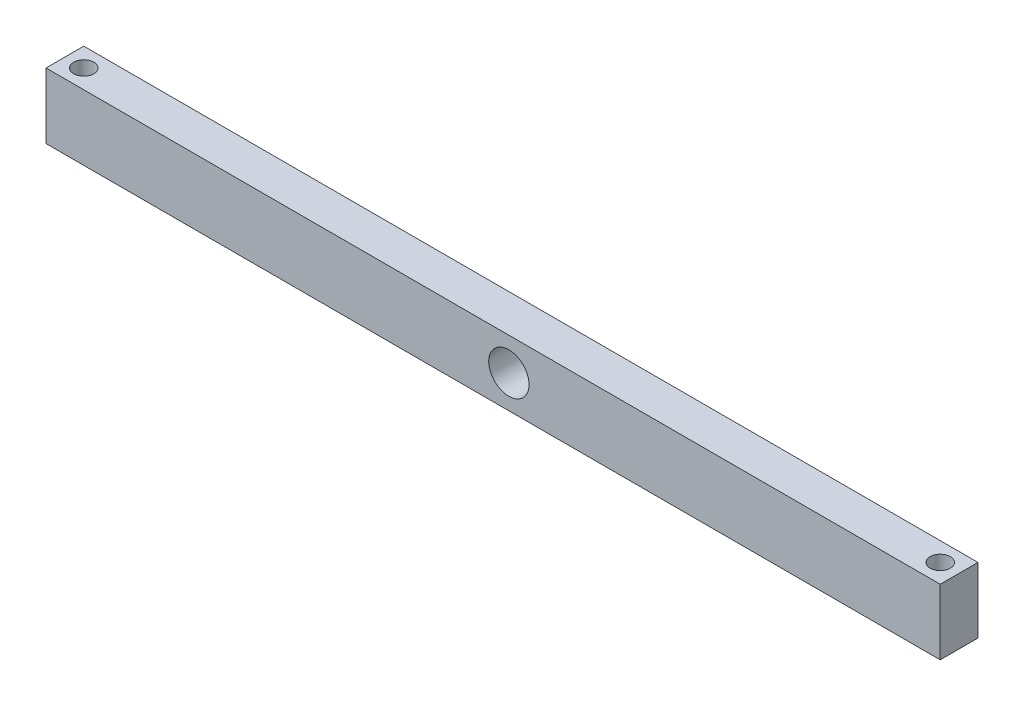
ISO-10303-21;
HEADER;
FILE_DESCRIPTION(('STEP AP214'),'2;1');
FILE_NAME('part.step','',(''),(''),'','','');
FILE_SCHEMA(('AUTOMOTIVE_DESIGN { 1 0 10303 214 1 1 1 1 }'));
ENDSEC;
DATA;
#1=APPLICATION_CONTEXT('core data for automotive mechanical design processes');
#2=APPLICATION_PROTOCOL_DEFINITION('international standard','automotive_design',2000,#1);
#3=PRODUCT_CONTEXT('',#1,'mechanical');
#4=PRODUCT('Part','Part','',(#3));
#5=PRODUCT_RELATED_PRODUCT_CATEGORY('part','',(#4));
#6=PRODUCT_DEFINITION_FORMATION('','',#4);
#7=PRODUCT_DEFINITION_CONTEXT('part definition',#1,'design');
#8=PRODUCT_DEFINITION('design','',#6,#7);
#9=PRODUCT_DEFINITION_SHAPE('','',#8);
#10=(LENGTH_UNIT() NAMED_UNIT(*) SI_UNIT(.MILLI.,.METRE.));
#11=(NAMED_UNIT(*) PLANE_ANGLE_UNIT() SI_UNIT($,.RADIAN.));
#12=(NAMED_UNIT(*) SI_UNIT($,.STERADIAN.) SOLID_ANGLE_UNIT());
#13=UNCERTAINTY_MEASURE_WITH_UNIT(LENGTH_MEASURE(1.E-05),#10,'distance_accuracy_value','');
#14=(GEOMETRIC_REPRESENTATION_CONTEXT(3) GLOBAL_UNCERTAINTY_ASSIGNED_CONTEXT((#13)) GLOBAL_UNIT_ASSIGNED_CONTEXT((#10,
#11,#12)) REPRESENTATION_CONTEXT('',''));
#15=CARTESIAN_POINT('',(0.,0.,0.));
#16=DIRECTION('',(0.,0.,1.));
#17=DIRECTION('',(1.,0.,0.));
#18=AXIS2_PLACEMENT_3D('',#15,#16,#17);
#19=CARTESIAN_POINT('',(-54.9147492894633,5.2,19.5853433742022));
#20=DIRECTION('',(1.,0.,0.));
#21=DIRECTION('',(0.,0.,-1.));
#22=AXIS2_PLACEMENT_3D('',#19,#20,#21);
#23=PLANE('',#22);
#24=DIRECTION('',(0.,0.,1.));
#25=VECTOR('',#24,1.);
#26=CARTESIAN_POINT('',(-54.9147492894633,0.,19.5853433742022));
#27=LINE('',#26,#25);
#28=CARTESIAN_POINT('',(-54.9147492894633,0.,16.5853433742022));
#29=VERTEX_POINT('',#28);
#30=CARTESIAN_POINT('',(-54.9147492894633,0.,19.5853433742022));
#31=VERTEX_POINT('',#30);
#32=EDGE_CURVE('E96',#29,#31,#27,.T.);
#33=ORIENTED_EDGE('',*,*,#32,.T.);
#34=DIRECTION('',(0.,-1.,0.));
#35=VECTOR('',#34,1.);
#36=CARTESIAN_POINT('',(-54.9147492894633,5.2,19.5853433742022));
#37=LINE('',#36,#35);
#38=CARTESIAN_POINT('',(-54.9147492894633,5.2,19.5853433742022));
#39=VERTEX_POINT('',#38);
#40=EDGE_CURVE('E11',#39,#31,#37,.T.);
#41=ORIENTED_EDGE('',*,*,#40,.F.);
#42=DIRECTION('',(0.,0.,1.));
#43=VECTOR('',#42,1.);
#44=CARTESIAN_POINT('',(-54.9147492894633,5.2,19.5853433742022));
#45=LINE('',#44,#43);
#46=CARTESIAN_POINT('',(-54.9147492894633,5.2,16.5853433742022));
#47=VERTEX_POINT('',#46);
#48=EDGE_CURVE('E84',#47,#39,#45,.T.);
#49=ORIENTED_EDGE('',*,*,#48,.F.);
#50=DIRECTION('',(0.,-1.,0.));
#51=VECTOR('',#50,1.);
#52=CARTESIAN_POINT('',(-54.9147492894633,5.2,16.5853433742022));
#53=LINE('',#52,#51);
#54=EDGE_CURVE('E92',#47,#29,#53,.T.);
#55=ORIENTED_EDGE('',*,*,#54,.T.);
#56=EDGE_LOOP('',(#33,#41,#49,#55));
#57=FACE_BOUND('',#56,.T.);
#58=ADVANCED_FACE('F33',(#57),#23,.F.);
#59=CARTESIAN_POINT('',(-54.9147492894633,5.2,19.5853433742022));
#60=DIRECTION('',(0.,0.,-1.));
#61=DIRECTION('',(-1.,0.,0.));
#62=AXIS2_PLACEMENT_3D('',#59,#60,#61);
#63=PLANE('',#62);
#64=CARTESIAN_POINT('',(-18.1647492894633,2.6,19.5853433742022));
#65=DIRECTION('',(0.,0.,-1.));
#66=DIRECTION('',(-1.,0.,0.));
#67=AXIS2_PLACEMENT_3D('',#64,#65,#66);
#68=CIRCLE('',#67,1.6);
#69=CARTESIAN_POINT('',(-19.7647492894633,2.6,19.5853433742022));
#70=VERTEX_POINT('',#69);
#71=EDGE_CURVE('E119',#70,#70,#68,.T.);
#72=ORIENTED_EDGE('',*,*,#71,.T.);
#73=EDGE_LOOP('',(#72));
#74=FACE_BOUND('',#73,.T.);
#75=DIRECTION('',(1.,0.,0.));
#76=VECTOR('',#75,1.);
#77=CARTESIAN_POINT('',(-54.9147492894633,0.,19.5853433742022));
#78=LINE('',#77,#76);
#79=CARTESIAN_POINT('',(16.0852507105367,0.,19.5853433742022));
#80=VERTEX_POINT('',#79);
#81=EDGE_CURVE('E88',#31,#80,#78,.T.);
#82=ORIENTED_EDGE('',*,*,#81,.T.);
#83=DIRECTION('',(0.,-1.,0.));
#84=VECTOR('',#83,1.);
#85=CARTESIAN_POINT('',(16.0852507105367,5.2,19.5853433742022));
#86=LINE('',#85,#84);
#87=CARTESIAN_POINT('',(16.0852507105367,5.2,19.5853433742022));
#88=VERTEX_POINT('',#87);
#89=EDGE_CURVE('E41',#88,#80,#86,.T.);
#90=ORIENTED_EDGE('',*,*,#89,.F.);
#91=DIRECTION('',(1.,0.,0.));
#92=VECTOR('',#91,1.);
#93=CARTESIAN_POINT('',(-54.9147492894633,5.2,19.5853433742022));
#94=LINE('',#93,#92);
#95=EDGE_CURVE('E79',#39,#88,#94,.T.);
#96=ORIENTED_EDGE('',*,*,#95,.F.);
#97=ORIENTED_EDGE('',*,*,#40,.T.);
#98=EDGE_LOOP('',(#82,#90,#96,#97));
#99=FACE_BOUND('',#98,.T.);
#100=ADVANCED_FACE('F87',(#74,#99),#63,.F.);
#101=CARTESIAN_POINT('',(16.0852507105367,5.2,19.5853433742022));
#102=DIRECTION('',(-1.,0.,0.));
#103=DIRECTION('',(0.,0.,1.));
#104=AXIS2_PLACEMENT_3D('',#101,#102,#103);
#105=PLANE('',#104);
#106=DIRECTION('',(0.,0.,-1.));
#107=VECTOR('',#106,1.);
#108=CARTESIAN_POINT('',(16.0852507105367,0.,19.5853433742022));
#109=LINE('',#108,#107);
#110=CARTESIAN_POINT('',(16.0852507105367,0.,16.5853433742022));
#111=VERTEX_POINT('',#110);
#112=EDGE_CURVE('E66',#80,#111,#109,.T.);
#113=ORIENTED_EDGE('',*,*,#112,.T.);
#114=DIRECTION('',(0.,-1.,0.));
#115=VECTOR('',#114,1.);
#116=CARTESIAN_POINT('',(16.0852507105367,5.2,16.5853433742022));
#117=LINE('',#116,#115);
#118=CARTESIAN_POINT('',(16.0852507105367,5.2,16.5853433742022));
#119=VERTEX_POINT('',#118);
#120=EDGE_CURVE('E89',#119,#111,#117,.T.);
#121=ORIENTED_EDGE('',*,*,#120,.F.);
#122=DIRECTION('',(0.,0.,-1.));
#123=VECTOR('',#122,1.);
#124=CARTESIAN_POINT('',(16.0852507105367,5.2,19.5853433742022));
#125=LINE('',#124,#123);
#126=EDGE_CURVE('E82',#88,#119,#125,.T.);
#127=ORIENTED_EDGE('',*,*,#126,.F.);
#128=ORIENTED_EDGE('',*,*,#89,.T.);
#129=EDGE_LOOP('',(#113,#121,#127,#128));
#130=FACE_BOUND('',#129,.T.);
#131=ADVANCED_FACE('F90',(#130),#105,.F.);
#132=CARTESIAN_POINT('',(-54.9147492894633,5.2,16.5853433742022));
#133=DIRECTION('',(0.,0.,1.));
#134=DIRECTION('',(1.,0.,0.));
#135=AXIS2_PLACEMENT_3D('',#132,#133,#134);
#136=PLANE('',#135);
#137=CARTESIAN_POINT('',(-18.1647492894633,2.6,16.5853433742022));
#138=DIRECTION('',(0.,0.,-1.));
#139=DIRECTION('',(-1.,0.,0.));
#140=AXIS2_PLACEMENT_3D('',#137,#138,#139);
#141=CIRCLE('',#140,1.6);
#142=CARTESIAN_POINT('',(-19.7647492894633,2.6,16.5853433742022));
#143=VERTEX_POINT('',#142);
#144=EDGE_CURVE('E124',#143,#143,#141,.T.);
#145=ORIENTED_EDGE('',*,*,#144,.F.);
#146=EDGE_LOOP('',(#145));
#147=FACE_BOUND('',#146,.T.);
#148=DIRECTION('',(-1.,0.,0.));
#149=VECTOR('',#148,1.);
#150=CARTESIAN_POINT('',(-54.9147492894633,0.,16.5853433742022));
#151=LINE('',#150,#149);
#152=EDGE_CURVE('E72',#111,#29,#151,.T.);
#153=ORIENTED_EDGE('',*,*,#152,.T.);
#154=ORIENTED_EDGE('',*,*,#54,.F.);
#155=DIRECTION('',(-1.,0.,0.));
#156=VECTOR('',#155,1.);
#157=CARTESIAN_POINT('',(-54.9147492894633,5.2,16.5853433742022));
#158=LINE('',#157,#156);
#159=EDGE_CURVE('E49',#119,#47,#158,.T.);
#160=ORIENTED_EDGE('',*,*,#159,.F.);
#161=ORIENTED_EDGE('',*,*,#120,.T.);
#162=EDGE_LOOP('',(#153,#154,#160,#161));
#163=FACE_BOUND('',#162,.T.);
#164=ADVANCED_FACE('F104',(#147,#163),#136,.F.);
#165=CARTESIAN_POINT('',(0.,5.2,0.));
#166=DIRECTION('',(0.,-1.,0.));
#167=DIRECTION('',(0.,0.,-1.));
#168=AXIS2_PLACEMENT_3D('',#165,#166,#167);
#169=PLANE('',#168);
#170=CARTESIAN_POINT('',(14.5852507105367,5.2,18.0853433742022));
#171=DIRECTION('',(0.,1.,0.));
#172=DIRECTION('',(0.,0.,1.));
#173=AXIS2_PLACEMENT_3D('',#170,#171,#172);
#174=CIRCLE('',#173,0.8);
#175=CARTESIAN_POINT('',(14.5852507105367,5.2,18.8853433742022));
#176=VERTEX_POINT('',#175);
#177=EDGE_CURVE('E116',#176,#176,#174,.T.);
#178=ORIENTED_EDGE('',*,*,#177,.F.);
#179=EDGE_LOOP('',(#178));
#180=FACE_BOUND('',#179,.T.);
#181=CARTESIAN_POINT('',(-53.4147492894633,5.2,18.0853433742022));
#182=DIRECTION('',(0.,1.,0.));
#183=DIRECTION('',(0.,0.,1.));
#184=AXIS2_PLACEMENT_3D('',#181,#182,#183);
#185=CIRCLE('',#184,0.800000000000003);
#186=CARTESIAN_POINT('',(-53.4147492894633,5.2,18.8853433742022));
#187=VERTEX_POINT('',#186);
#188=EDGE_CURVE('E110',#187,#187,#185,.T.);
#189=ORIENTED_EDGE('',*,*,#188,.F.);
#190=EDGE_LOOP('',(#189));
#191=FACE_BOUND('',#190,.T.);
#192=ORIENTED_EDGE('',*,*,#48,.T.);
#193=ORIENTED_EDGE('',*,*,#95,.T.);
#194=ORIENTED_EDGE('',*,*,#126,.T.);
#195=ORIENTED_EDGE('',*,*,#159,.T.);
#196=EDGE_LOOP('',(#192,#193,#194,#195));
#197=FACE_BOUND('',#196,.T.);
#198=ADVANCED_FACE('F80',(#180,#191,#197),#169,.F.);
#199=CARTESIAN_POINT('',(0.,0.,0.));
#200=DIRECTION('',(0.,-1.,0.));
#201=DIRECTION('',(0.,0.,-1.));
#202=AXIS2_PLACEMENT_3D('',#199,#200,#201);
#203=PLANE('',#202);
#204=CARTESIAN_POINT('',(14.5852507105367,0.,18.0853433742022));
#205=DIRECTION('',(0.,1.,0.));
#206=DIRECTION('',(0.,0.,1.));
#207=AXIS2_PLACEMENT_3D('',#204,#205,#206);
#208=CIRCLE('',#207,0.8);
#209=CARTESIAN_POINT('',(14.5852507105367,0.,18.8853433742022));
#210=VERTEX_POINT('',#209);
#211=EDGE_CURVE('E113',#210,#210,#208,.T.);
#212=ORIENTED_EDGE('',*,*,#211,.T.);
#213=EDGE_LOOP('',(#212));
#214=FACE_BOUND('',#213,.T.);
#215=CARTESIAN_POINT('',(-53.4147492894633,0.,18.0853433742022));
#216=DIRECTION('',(0.,1.,0.));
#217=DIRECTION('',(0.,0.,1.));
#218=AXIS2_PLACEMENT_3D('',#215,#216,#217);
#219=CIRCLE('',#218,0.800000000000003);
#220=CARTESIAN_POINT('',(-53.4147492894633,0.,18.8853433742022));
#221=VERTEX_POINT('',#220);
#222=EDGE_CURVE('E99',#221,#221,#219,.T.);
#223=ORIENTED_EDGE('',*,*,#222,.T.);
#224=EDGE_LOOP('',(#223));
#225=FACE_BOUND('',#224,.T.);
#226=ORIENTED_EDGE('',*,*,#32,.F.);
#227=ORIENTED_EDGE('',*,*,#152,.F.);
#228=ORIENTED_EDGE('',*,*,#112,.F.);
#229=ORIENTED_EDGE('',*,*,#81,.F.);
#230=EDGE_LOOP('',(#226,#227,#228,#229));
#231=FACE_BOUND('',#230,.T.);
#232=ADVANCED_FACE('F107',(#214,#225,#231),#203,.T.);
#233=CARTESIAN_POINT('',(-53.4147492894633,0.,18.0853433742022));
#234=DIRECTION('',(0.,1.,0.));
#235=DIRECTION('',(0.,0.,1.));
#236=AXIS2_PLACEMENT_3D('',#233,#234,#235);
#237=CYLINDRICAL_SURFACE('',#236,0.800000000000003);
#238=ORIENTED_EDGE('',*,*,#222,.F.);
#239=EDGE_LOOP('',(#238));
#240=FACE_BOUND('',#239,.T.);
#241=ORIENTED_EDGE('',*,*,#188,.T.);
#242=EDGE_LOOP('',(#241));
#243=FACE_BOUND('',#242,.T.);
#244=ADVANCED_FACE('F155',(#240,#243),#237,.F.);
#245=CARTESIAN_POINT('',(14.5852507105367,0.,18.0853433742022));
#246=DIRECTION('',(0.,1.,0.));
#247=DIRECTION('',(0.,0.,1.));
#248=AXIS2_PLACEMENT_3D('',#245,#246,#247);
#249=CYLINDRICAL_SURFACE('',#248,0.8);
#250=ORIENTED_EDGE('',*,*,#211,.F.);
#251=EDGE_LOOP('',(#250));
#252=FACE_BOUND('',#251,.T.);
#253=ORIENTED_EDGE('',*,*,#177,.T.);
#254=EDGE_LOOP('',(#253));
#255=FACE_BOUND('',#254,.T.);
#256=ADVANCED_FACE('F150',(#252,#255),#249,.F.);
#257=CARTESIAN_POINT('',(-18.1647492894633,2.6,21.7853433742022));
#258=DIRECTION('',(0.,0.,-1.));
#259=DIRECTION('',(-1.,0.,0.));
#260=AXIS2_PLACEMENT_3D('',#257,#258,#259);
#261=CYLINDRICAL_SURFACE('',#260,1.6);
#262=ORIENTED_EDGE('',*,*,#144,.T.);
#263=EDGE_LOOP('',(#262));
#264=FACE_BOUND('',#263,.T.);
#265=ORIENTED_EDGE('',*,*,#71,.F.);
#266=EDGE_LOOP('',(#265));
#267=FACE_BOUND('',#266,.T.);
#268=ADVANCED_FACE('F128',(#264,#267),#261,.F.);
#269=CLOSED_SHELL('',(#58,#100,#131,#164,#198,#232,#244,#256,#268));
#270=MANIFOLD_SOLID_BREP('B2',#269);
#271=ADVANCED_BREP_SHAPE_REPRESENTATION('',(#18,#270),#14);
#272=SHAPE_DEFINITION_REPRESENTATION(#9,#271);
ENDSEC;
END-ISO-10303-21;
